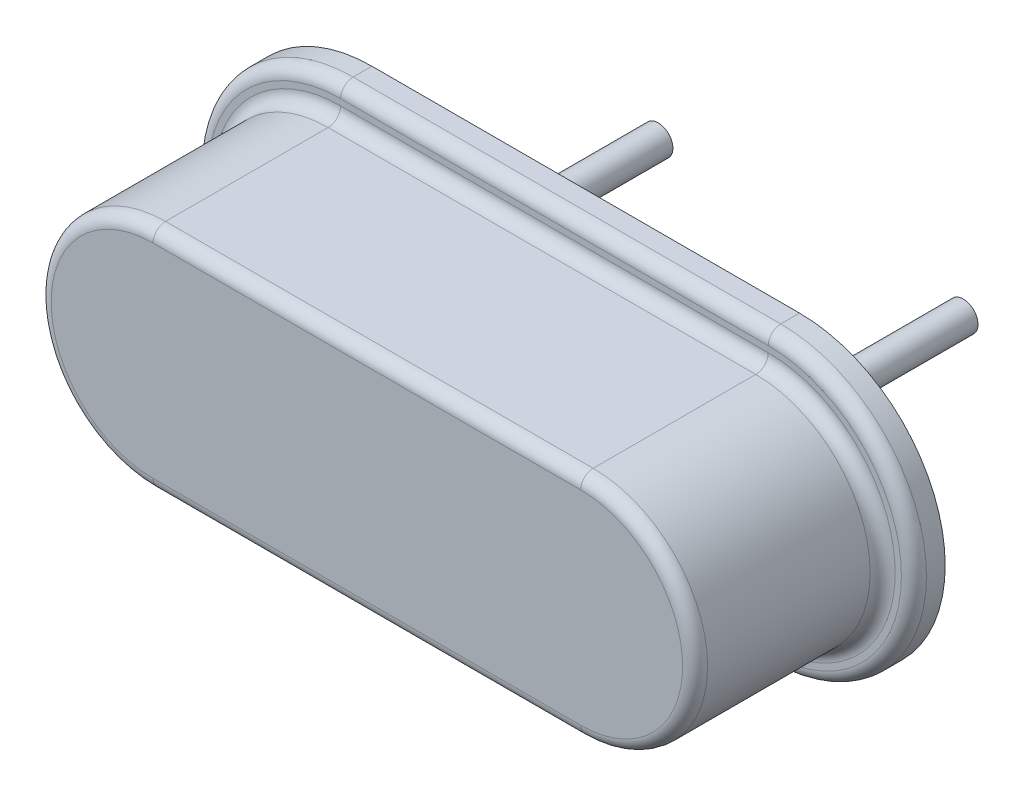
ISO-10303-21;
HEADER;
FILE_DESCRIPTION(('STEP AP214'),'2;1');
FILE_NAME('part.step','',(''),(''),'','','');
FILE_SCHEMA(('AUTOMOTIVE_DESIGN { 1 0 10303 214 1 1 1 1 }'));
ENDSEC;
DATA;
#1=APPLICATION_CONTEXT('core data for automotive mechanical design processes');
#2=APPLICATION_PROTOCOL_DEFINITION('international standard','automotive_design',2000,#1);
#3=PRODUCT_CONTEXT('',#1,'mechanical');
#4=PRODUCT('Part','Part','',(#3));
#5=PRODUCT_RELATED_PRODUCT_CATEGORY('part','',(#4));
#6=PRODUCT_DEFINITION_FORMATION('','',#4);
#7=PRODUCT_DEFINITION_CONTEXT('part definition',#1,'design');
#8=PRODUCT_DEFINITION('design','',#6,#7);
#9=PRODUCT_DEFINITION_SHAPE('','',#8);
#10=(LENGTH_UNIT() NAMED_UNIT(*) SI_UNIT(.MILLI.,.METRE.));
#11=(NAMED_UNIT(*) PLANE_ANGLE_UNIT() SI_UNIT($,.RADIAN.));
#12=(NAMED_UNIT(*) SI_UNIT($,.STERADIAN.) SOLID_ANGLE_UNIT());
#13=UNCERTAINTY_MEASURE_WITH_UNIT(LENGTH_MEASURE(1.E-05),#10,'distance_accuracy_value','');
#14=(GEOMETRIC_REPRESENTATION_CONTEXT(3) GLOBAL_UNCERTAINTY_ASSIGNED_CONTEXT((#13)) GLOBAL_UNIT_ASSIGNED_CONTEXT((#10,
#11,#12)) REPRESENTATION_CONTEXT('',''));
#15=CARTESIAN_POINT('',(0.,0.,0.));
#16=DIRECTION('',(0.,0.,1.));
#17=DIRECTION('',(1.,0.,0.));
#18=AXIS2_PLACEMENT_3D('',#15,#16,#17);
#19=CARTESIAN_POINT('',(-2.44,0.,-3.6));
#20=DIRECTION('',(0.,0.,-1.));
#21=DIRECTION('',(-1.,0.,0.));
#22=AXIS2_PLACEMENT_3D('',#19,#20,#21);
#23=PLANE('',#22);
#24=CARTESIAN_POINT('',(-2.44,0.,-3.6));
#25=DIRECTION('',(0.,0.,-1.));
#26=DIRECTION('',(0.,1.,0.));
#27=AXIS2_PLACEMENT_3D('',#24,#25,#26);
#28=CIRCLE('',#27,0.235);
#29=CARTESIAN_POINT('',(-2.44,0.235,-3.6));
#30=VERTEX_POINT('',#29);
#31=EDGE_CURVE('P0_E17',#30,#30,#28,.F.);
#32=ORIENTED_EDGE('',*,*,#31,.F.);
#33=EDGE_LOOP('',(#32));
#34=FACE_BOUND('',#33,.T.);
#35=ADVANCED_FACE('P0_F14',(#34),#23,.T.);
#36=CARTESIAN_POINT('',(-2.44,0.,0.));
#37=DIRECTION('',(0.,0.,1.));
#38=DIRECTION('',(1.,0.,0.));
#39=AXIS2_PLACEMENT_3D('',#36,#37,#38);
#40=PLANE('',#39);
#41=CARTESIAN_POINT('',(-2.44,0.,0.));
#42=DIRECTION('',(0.,0.,-1.));
#43=DIRECTION('',(0.,1.,0.));
#44=AXIS2_PLACEMENT_3D('',#41,#42,#43);
#45=CIRCLE('',#44,0.235);
#46=CARTESIAN_POINT('',(-2.44,0.235,0.));
#47=VERTEX_POINT('',#46);
#48=EDGE_CURVE('P0_E10',#47,#47,#45,.T.);
#49=ORIENTED_EDGE('',*,*,#48,.F.);
#50=EDGE_LOOP('',(#49));
#51=FACE_BOUND('',#50,.T.);
#52=ADVANCED_FACE('P0_F29',(#51),#40,.T.);
#53=CARTESIAN_POINT('',(-2.44,0.,-1.8));
#54=DIRECTION('',(0.,0.,-1.));
#55=DIRECTION('',(0.,1.,0.));
#56=AXIS2_PLACEMENT_3D('',#53,#54,#55);
#57=CYLINDRICAL_SURFACE('',#56,0.235);
#58=ORIENTED_EDGE('',*,*,#31,.T.);
#59=EDGE_LOOP('',(#58));
#60=FACE_BOUND('',#59,.T.);
#61=ORIENTED_EDGE('',*,*,#48,.T.);
#62=EDGE_LOOP('',(#61));
#63=FACE_BOUND('',#62,.T.);
#64=ADVANCED_FACE('P0_F26',(#60,#63),#57,.T.);
#65=CLOSED_SHELL('',(#35,#52,#64));
#66=MANIFOLD_SOLID_BREP('P0_B1',#65);
#67=CARTESIAN_POINT('',(0.,0.,3.5));
#68=DIRECTION('',(0.,0.,1.));
#69=DIRECTION('',(1.,0.,0.));
#70=AXIS2_PLACEMENT_3D('',#67,#68,#69);
#71=PLANE('',#70);
#72=DIRECTION('',(-1.,0.,0.));
#73=VECTOR('',#72,1.);
#74=CARTESIAN_POINT('',(1.71,-1.63,3.5));
#75=LINE('',#74,#73);
#76=CARTESIAN_POINT('',(3.42,-1.63,3.5));
#77=VERTEX_POINT('',#76);
#78=CARTESIAN_POINT('',(-3.42,-1.63,3.5));
#79=VERTEX_POINT('',#78);
#80=EDGE_CURVE('P1_E112',#77,#79,#75,.T.);
#81=ORIENTED_EDGE('',*,*,#80,.F.);
#82=CARTESIAN_POINT('',(3.42,0.,3.5));
#83=DIRECTION('',(0.,0.,-1.));
#84=DIRECTION('',(0.,1.,0.));
#85=AXIS2_PLACEMENT_3D('',#82,#83,#84);
#86=CIRCLE('',#85,1.63);
#87=CARTESIAN_POINT('',(3.42,1.63,3.5));
#88=VERTEX_POINT('',#87);
#89=EDGE_CURVE('P1_E135',#88,#77,#86,.T.);
#90=ORIENTED_EDGE('',*,*,#89,.F.);
#91=DIRECTION('',(1.,0.,0.));
#92=VECTOR('',#91,1.);
#93=CARTESIAN_POINT('',(-1.71,1.63,3.5));
#94=LINE('',#93,#92);
#95=CARTESIAN_POINT('',(-3.42,1.63,3.5));
#96=VERTEX_POINT('',#95);
#97=EDGE_CURVE('P1_E113',#96,#88,#94,.T.);
#98=ORIENTED_EDGE('',*,*,#97,.F.);
#99=CARTESIAN_POINT('',(-3.42,0.,3.5));
#100=DIRECTION('',(0.,0.,-1.));
#101=DIRECTION('',(0.,-1.,0.));
#102=AXIS2_PLACEMENT_3D('',#99,#100,#101);
#103=CIRCLE('',#102,1.63);
#104=EDGE_CURVE('P1_E108',#79,#96,#103,.T.);
#105=ORIENTED_EDGE('',*,*,#104,.F.);
#106=EDGE_LOOP('',(#81,#90,#98,#105));
#107=FACE_BOUND('',#106,.T.);
#108=ADVANCED_FACE('P1_F16',(#107),#71,.T.);
#109=CARTESIAN_POINT('',(-3.42,0.,3.3));
#110=DIRECTION('',(0.,0.,-1.));
#111=DIRECTION('',(-1.,0.,0.));
#112=AXIS2_PLACEMENT_3D('',#109,#110,#111);
#113=TOROIDAL_SURFACE('',#112,1.63,0.2);
#114=CARTESIAN_POINT('',(-3.42,1.63,3.3));
#115=DIRECTION('',(1.,0.,0.));
#116=DIRECTION('',(0.,0.,-1.));
#117=AXIS2_PLACEMENT_3D('',#114,#115,#116);
#118=CIRCLE('',#117,0.2);
#119=CARTESIAN_POINT('',(-3.42,1.83,3.3));
#120=VERTEX_POINT('',#119);
#121=EDGE_CURVE('P1_E119',#120,#96,#118,.T.);
#122=ORIENTED_EDGE('',*,*,#121,.F.);
#123=CARTESIAN_POINT('',(-3.42,0.,3.3));
#124=DIRECTION('',(0.,0.,1.));
#125=DIRECTION('',(1.,0.,0.));
#126=AXIS2_PLACEMENT_3D('',#123,#124,#125);
#127=CIRCLE('',#126,1.83);
#128=CARTESIAN_POINT('',(-3.42,-1.83,3.3));
#129=VERTEX_POINT('',#128);
#130=EDGE_CURVE('P1_E130',#129,#120,#127,.F.);
#131=ORIENTED_EDGE('',*,*,#130,.F.);
#132=CARTESIAN_POINT('',(-3.42,-1.63,3.3));
#133=DIRECTION('',(-1.,0.,0.));
#134=DIRECTION('',(0.,0.,1.));
#135=AXIS2_PLACEMENT_3D('',#132,#133,#134);
#136=CIRCLE('',#135,0.2);
#137=EDGE_CURVE('P1_E126',#79,#129,#136,.F.);
#138=ORIENTED_EDGE('',*,*,#137,.F.);
#139=ORIENTED_EDGE('',*,*,#104,.T.);
#140=EDGE_LOOP('',(#122,#131,#138,#139));
#141=FACE_BOUND('',#140,.T.);
#142=ADVANCED_FACE('P1_F133',(#141),#113,.T.);
#143=CARTESIAN_POINT('',(-1.71,1.63,3.3));
#144=DIRECTION('',(1.,0.,0.));
#145=DIRECTION('',(0.,0.,-1.));
#146=AXIS2_PLACEMENT_3D('',#143,#144,#145);
#147=CYLINDRICAL_SURFACE('',#146,0.2);
#148=CARTESIAN_POINT('',(3.42,1.63,3.3));
#149=DIRECTION('',(1.,0.,0.));
#150=DIRECTION('',(0.,1.,0.));
#151=AXIS2_PLACEMENT_3D('',#148,#149,#150);
#152=CIRCLE('',#151,0.2);
#153=CARTESIAN_POINT('',(3.42,1.83,3.3));
#154=VERTEX_POINT('',#153);
#155=EDGE_CURVE('P1_E138',#154,#88,#152,.T.);
#156=ORIENTED_EDGE('',*,*,#155,.F.);
#157=DIRECTION('',(1.,0.,0.));
#158=VECTOR('',#157,1.);
#159=CARTESIAN_POINT('',(-3.42,1.83,3.3));
#160=LINE('',#159,#158);
#161=EDGE_CURVE('P1_E144',#120,#154,#160,.T.);
#162=ORIENTED_EDGE('',*,*,#161,.F.);
#163=ORIENTED_EDGE('',*,*,#121,.T.);
#164=ORIENTED_EDGE('',*,*,#97,.T.);
#165=EDGE_LOOP('',(#156,#162,#163,#164));
#166=FACE_BOUND('',#165,.T.);
#167=ADVANCED_FACE('P1_F158',(#166),#147,.T.);
#168=CARTESIAN_POINT('',(3.42,0.,3.3));
#169=DIRECTION('',(0.,0.,-1.));
#170=DIRECTION('',(-1.,0.,0.));
#171=AXIS2_PLACEMENT_3D('',#168,#169,#170);
#172=TOROIDAL_SURFACE('',#171,1.63,0.2);
#173=ORIENTED_EDGE('',*,*,#155,.T.);
#174=ORIENTED_EDGE('',*,*,#89,.T.);
#175=CARTESIAN_POINT('',(3.42,-1.63,3.3));
#176=DIRECTION('',(-1.,0.,0.));
#177=DIRECTION('',(0.,0.,1.));
#178=AXIS2_PLACEMENT_3D('',#175,#176,#177);
#179=CIRCLE('',#178,0.2);
#180=CARTESIAN_POINT('',(3.42,-1.83,3.3));
#181=VERTEX_POINT('',#180);
#182=EDGE_CURVE('P1_E129',#181,#77,#179,.T.);
#183=ORIENTED_EDGE('',*,*,#182,.F.);
#184=CARTESIAN_POINT('',(3.42,0.,3.3));
#185=DIRECTION('',(0.,0.,1.));
#186=DIRECTION('',(1.,0.,0.));
#187=AXIS2_PLACEMENT_3D('',#184,#185,#186);
#188=CIRCLE('',#187,1.83);
#189=EDGE_CURVE('P1_E206',#154,#181,#188,.F.);
#190=ORIENTED_EDGE('',*,*,#189,.F.);
#191=EDGE_LOOP('',(#173,#174,#183,#190));
#192=FACE_BOUND('',#191,.T.);
#193=ADVANCED_FACE('P1_F153',(#192),#172,.T.);
#194=CARTESIAN_POINT('',(1.71,-1.63,3.3));
#195=DIRECTION('',(-1.,0.,0.));
#196=DIRECTION('',(0.,0.,1.));
#197=AXIS2_PLACEMENT_3D('',#194,#195,#196);
#198=CYLINDRICAL_SURFACE('',#197,0.2);
#199=ORIENTED_EDGE('',*,*,#182,.T.);
#200=ORIENTED_EDGE('',*,*,#80,.T.);
#201=ORIENTED_EDGE('',*,*,#137,.T.);
#202=DIRECTION('',(1.,0.,0.));
#203=VECTOR('',#202,1.);
#204=CARTESIAN_POINT('',(3.42,-1.83,3.3));
#205=LINE('',#204,#203);
#206=EDGE_CURVE('P1_E218',#181,#129,#205,.F.);
#207=ORIENTED_EDGE('',*,*,#206,.F.);
#208=EDGE_LOOP('',(#199,#200,#201,#207));
#209=FACE_BOUND('',#208,.T.);
#210=ADVANCED_FACE('P1_F124',(#209),#198,.T.);
#211=CARTESIAN_POINT('',(-3.42,0.,0.5));
#212=DIRECTION('',(0.,0.,1.));
#213=DIRECTION('',(1.,0.,0.));
#214=AXIS2_PLACEMENT_3D('',#211,#212,#213);
#215=CYLINDRICAL_SURFACE('',#214,1.83);
#216=CARTESIAN_POINT('',(-3.42,0.,0.7));
#217=DIRECTION('',(0.,0.,-1.));
#218=DIRECTION('',(-1.,0.,0.));
#219=AXIS2_PLACEMENT_3D('',#216,#217,#218);
#220=CIRCLE('',#219,1.83000000000007);
#221=CARTESIAN_POINT('',(-3.42,-1.83000000000002,0.7));
#222=VERTEX_POINT('',#221);
#223=CARTESIAN_POINT('',(-3.42,1.83000000000002,0.7));
#224=VERTEX_POINT('',#223);
#225=EDGE_CURVE('P1_E226',#222,#224,#220,.T.);
#226=ORIENTED_EDGE('',*,*,#225,.F.);
#227=DIRECTION('',(0.,0.,-1.));
#228=VECTOR('',#227,1.);
#229=CARTESIAN_POINT('',(-3.42,-1.83,0.5));
#230=LINE('',#229,#228);
#231=EDGE_CURVE('P1_E220',#129,#222,#230,.T.);
#232=ORIENTED_EDGE('',*,*,#231,.F.);
#233=ORIENTED_EDGE('',*,*,#130,.T.);
#234=DIRECTION('',(0.,0.,1.));
#235=VECTOR('',#234,1.);
#236=CARTESIAN_POINT('',(-3.42,1.83,0.5));
#237=LINE('',#236,#235);
#238=EDGE_CURVE('P1_E146',#224,#120,#237,.T.);
#239=ORIENTED_EDGE('',*,*,#238,.F.);
#240=EDGE_LOOP('',(#226,#232,#233,#239));
#241=FACE_BOUND('',#240,.T.);
#242=ADVANCED_FACE('P1_F225',(#241),#215,.T.);
#243=CARTESIAN_POINT('',(-3.42,1.83,0.5));
#244=DIRECTION('',(0.,1.,0.));
#245=DIRECTION('',(0.,0.,1.));
#246=AXIS2_PLACEMENT_3D('',#243,#244,#245);
#247=PLANE('',#246);
#248=DIRECTION('',(1.,0.,0.));
#249=VECTOR('',#248,1.);
#250=CARTESIAN_POINT('',(-1.71,1.83,0.7));
#251=LINE('',#250,#249);
#252=CARTESIAN_POINT('',(3.42,1.83000000000001,0.7));
#253=VERTEX_POINT('',#252);
#254=EDGE_CURVE('P1_E202',#253,#224,#251,.F.);
#255=ORIENTED_EDGE('',*,*,#254,.T.);
#256=ORIENTED_EDGE('',*,*,#238,.T.);
#257=ORIENTED_EDGE('',*,*,#161,.T.);
#258=DIRECTION('',(0.,0.,1.));
#259=VECTOR('',#258,1.);
#260=CARTESIAN_POINT('',(3.42,1.83,0.5));
#261=LINE('',#260,#259);
#262=EDGE_CURVE('P1_E208',#253,#154,#261,.T.);
#263=ORIENTED_EDGE('',*,*,#262,.F.);
#264=EDGE_LOOP('',(#255,#256,#257,#263));
#265=FACE_BOUND('',#264,.T.);
#266=ADVANCED_FACE('P1_F200',(#265),#247,.T.);
#267=CARTESIAN_POINT('',(3.42,0.,0.5));
#268=DIRECTION('',(0.,0.,1.));
#269=DIRECTION('',(1.,0.,0.));
#270=AXIS2_PLACEMENT_3D('',#267,#268,#269);
#271=CYLINDRICAL_SURFACE('',#270,1.83);
#272=CARTESIAN_POINT('',(3.42,0.,0.7));
#273=DIRECTION('',(0.,0.,-1.));
#274=DIRECTION('',(-1.,0.,0.));
#275=AXIS2_PLACEMENT_3D('',#272,#273,#274);
#276=CIRCLE('',#275,1.83000000000007);
#277=CARTESIAN_POINT('',(3.42,-1.83000000000002,0.7));
#278=VERTEX_POINT('',#277);
#279=EDGE_CURVE('P1_E70',#253,#278,#276,.T.);
#280=ORIENTED_EDGE('',*,*,#279,.F.);
#281=ORIENTED_EDGE('',*,*,#262,.T.);
#282=ORIENTED_EDGE('',*,*,#189,.T.);
#283=DIRECTION('',(0.,0.,-1.));
#284=VECTOR('',#283,1.);
#285=CARTESIAN_POINT('',(3.42,-1.83,0.5));
#286=LINE('',#285,#284);
#287=EDGE_CURVE('P1_E229',#278,#181,#286,.F.);
#288=ORIENTED_EDGE('',*,*,#287,.F.);
#289=EDGE_LOOP('',(#280,#281,#282,#288));
#290=FACE_BOUND('',#289,.T.);
#291=ADVANCED_FACE('P1_F580',(#290),#271,.T.);
#292=CARTESIAN_POINT('',(3.42,-1.83,0.5));
#293=DIRECTION('',(0.,-1.,0.));
#294=DIRECTION('',(0.,0.,-1.));
#295=AXIS2_PLACEMENT_3D('',#292,#293,#294);
#296=PLANE('',#295);
#297=DIRECTION('',(-1.,0.,0.));
#298=VECTOR('',#297,1.);
#299=CARTESIAN_POINT('',(1.71,-1.83,0.7));
#300=LINE('',#299,#298);
#301=EDGE_CURVE('P1_E260',#222,#278,#300,.F.);
#302=ORIENTED_EDGE('',*,*,#301,.T.);
#303=ORIENTED_EDGE('',*,*,#287,.T.);
#304=ORIENTED_EDGE('',*,*,#206,.T.);
#305=ORIENTED_EDGE('',*,*,#231,.T.);
#306=EDGE_LOOP('',(#302,#303,#304,#305));
#307=FACE_BOUND('',#306,.T.);
#308=ADVANCED_FACE('P1_F573',(#307),#296,.T.);
#309=CARTESIAN_POINT('',(-3.42,0.,0.7));
#310=DIRECTION('',(0.,0.,-1.));
#311=DIRECTION('',(-1.,0.,0.));
#312=AXIS2_PLACEMENT_3D('',#309,#310,#311);
#313=TOROIDAL_SURFACE('',#312,2.03,0.200000000000007);
#314=CARTESIAN_POINT('',(-3.42,2.03,0.7));
#315=DIRECTION('',(1.,0.,0.));
#316=DIRECTION('',(0.,0.,-1.));
#317=AXIS2_PLACEMENT_3D('',#314,#315,#316);
#318=CIRCLE('',#317,0.2);
#319=CARTESIAN_POINT('',(-3.42,2.03,0.5));
#320=VERTEX_POINT('',#319);
#321=EDGE_CURVE('P1_E244',#224,#320,#318,.T.);
#322=ORIENTED_EDGE('',*,*,#321,.T.);
#323=CARTESIAN_POINT('',(-3.42,-2.03,0.5));
#324=CARTESIAN_POINT('',(-3.80694173072653,-2.03,0.5));
#325=CARTESIAN_POINT('',(-4.1672322604106,-1.88747025115673,0.5));
#326=CARTESIAN_POINT('',(-4.55768861721886,-1.73300700029378,0.5));
#327=CARTESIAN_POINT('',(-4.85542676580869,-1.43542676580869,0.5));
#328=CARTESIAN_POINT('',(-5.15241952645898,-1.13859152392493,0.5));
#329=CARTESIAN_POINT('',(-5.30747025115673,-0.747232260410602,0.5));
#330=CARTESIAN_POINT('',(-5.44989869532549,-0.387732547513189,0.5));
#331=CARTESIAN_POINT('',(-5.45,0.,0.5));
#332=CARTESIAN_POINT('',(-5.4501010313273,0.386686341021617,0.5));
#333=CARTESIAN_POINT('',(-5.30747025115673,0.747232260410602,0.5));
#334=CARTESIAN_POINT('',(-5.15300700029418,1.13768861721837,0.5));
#335=CARTESIAN_POINT('',(-4.85542676580869,1.43542676580869,0.5));
#336=CARTESIAN_POINT('',(-4.5585915239251,1.7324195264589,0.5));
#337=CARTESIAN_POINT('',(-4.1672322604106,1.88747025115673,0.5));
#338=CARTESIAN_POINT('',(-3.80747684717463,2.03,0.5));
#339=CARTESIAN_POINT('',(-3.42,2.03,0.5));
#340=B_SPLINE_CURVE_WITH_KNOTS('',2,(#323,#324,#325,#326,#327,#328,#329,#330,#331,#332,#333,
#334,#335,#336,#337,#338,#339),.UNSPECIFIED.,.F.,.F.,(3,2,2,2,2,2,2,2,3),(0.,0.125,0.25,0.375,
0.5,0.625,0.75,0.875,1.),.UNSPECIFIED.);
#341=CARTESIAN_POINT('',(-3.42,-2.03,0.5));
#342=VERTEX_POINT('',#341);
#343=EDGE_CURVE('P1_E264',#342,#320,#340,.T.);
#344=ORIENTED_EDGE('',*,*,#343,.F.);
#345=CARTESIAN_POINT('',(-3.42,-2.03,0.7));
#346=DIRECTION('',(-1.,0.,0.));
#347=DIRECTION('',(0.,0.,1.));
#348=AXIS2_PLACEMENT_3D('',#345,#346,#347);
#349=CIRCLE('',#348,0.2);
#350=EDGE_CURVE('P1_E60',#342,#222,#349,.F.);
#351=ORIENTED_EDGE('',*,*,#350,.T.);
#352=ORIENTED_EDGE('',*,*,#225,.T.);
#353=EDGE_LOOP('',(#322,#344,#351,#352));
#354=FACE_BOUND('',#353,.T.);
#355=ADVANCED_FACE('P1_F564',(#354),#313,.F.);
#356=CARTESIAN_POINT('',(-1.71,2.03,0.7));
#357=DIRECTION('',(1.,0.,0.));
#358=DIRECTION('',(0.,0.,-1.));
#359=AXIS2_PLACEMENT_3D('',#356,#357,#358);
#360=CYLINDRICAL_SURFACE('',#359,0.2);
#361=DIRECTION('',(1.,0.,0.));
#362=VECTOR('',#361,1.);
#363=CARTESIAN_POINT('',(0.,2.03,0.5));
#364=LINE('',#363,#362);
#365=CARTESIAN_POINT('',(3.42,2.03,0.5));
#366=VERTEX_POINT('',#365);
#367=EDGE_CURVE('P1_E331',#320,#366,#364,.T.);
#368=ORIENTED_EDGE('',*,*,#367,.F.);
#369=ORIENTED_EDGE('',*,*,#321,.F.);
#370=ORIENTED_EDGE('',*,*,#254,.F.);
#371=CARTESIAN_POINT('',(3.42,2.03,0.7));
#372=DIRECTION('',(-1.,0.,0.));
#373=DIRECTION('',(0.,0.,1.));
#374=AXIS2_PLACEMENT_3D('',#371,#372,#373);
#375=CIRCLE('',#374,0.200000000000008);
#376=EDGE_CURVE('P1_E246',#366,#253,#375,.T.);
#377=ORIENTED_EDGE('',*,*,#376,.F.);
#378=EDGE_LOOP('',(#368,#369,#370,#377));
#379=FACE_BOUND('',#378,.T.);
#380=ADVANCED_FACE('P1_F557',(#379),#360,.F.);
#381=CARTESIAN_POINT('',(3.42,0.,0.699999999999999));
#382=DIRECTION('',(0.,0.,-1.));
#383=DIRECTION('',(-1.,0.,0.));
#384=AXIS2_PLACEMENT_3D('',#381,#382,#383);
#385=TOROIDAL_SURFACE('',#384,2.03,0.200000000000007);
#386=ORIENTED_EDGE('',*,*,#376,.T.);
#387=ORIENTED_EDGE('',*,*,#279,.T.);
#388=CARTESIAN_POINT('',(3.42,-2.03,0.7));
#389=DIRECTION('',(-1.,0.,0.));
#390=DIRECTION('',(0.,0.,1.));
#391=AXIS2_PLACEMENT_3D('',#388,#389,#390);
#392=CIRCLE('',#391,0.2);
#393=CARTESIAN_POINT('',(3.42,-2.03,0.5));
#394=VERTEX_POINT('',#393);
#395=EDGE_CURVE('P1_E262',#278,#394,#392,.T.);
#396=ORIENTED_EDGE('',*,*,#395,.T.);
#397=CARTESIAN_POINT('',(3.42,2.03,0.5));
#398=CARTESIAN_POINT('',(3.80694173072653,2.03,0.5));
#399=CARTESIAN_POINT('',(4.1672322604106,1.88747025115673,0.5));
#400=CARTESIAN_POINT('',(4.55768861721858,1.73300700029389,0.5));
#401=CARTESIAN_POINT('',(4.85542676580869,1.43542676580869,0.5));
#402=CARTESIAN_POINT('',(5.15241952645887,1.13859152392521,0.5));
#403=CARTESIAN_POINT('',(5.30747025115673,0.747232260410602,0.5));
#404=CARTESIAN_POINT('',(5.44989869532549,0.387732547513188,0.5));
#405=CARTESIAN_POINT('',(5.45,0.,0.5));
#406=CARTESIAN_POINT('',(5.4501010313273,-0.386686341021618,0.5));
#407=CARTESIAN_POINT('',(5.30747025115673,-0.747232260410603,0.5));
#408=CARTESIAN_POINT('',(5.15300700029429,-1.13768861721809,0.5));
#409=CARTESIAN_POINT('',(4.85542676580869,-1.43542676580869,0.5));
#410=CARTESIAN_POINT('',(4.55859152392568,-1.73241952645849,0.5));
#411=CARTESIAN_POINT('',(4.1672322604106,-1.88747025115673,0.5));
#412=CARTESIAN_POINT('',(3.80747684717504,-2.03,0.5));
#413=CARTESIAN_POINT('',(3.42,-2.03,0.5));
#414=B_SPLINE_CURVE_WITH_KNOTS('',2,(#397,#398,#399,#400,#401,#402,#403,#404,#405,#406,#407,
#408,#409,#410,#411,#412,#413),.UNSPECIFIED.,.F.,.F.,(3,2,2,2,2,2,2,2,3),(0.,0.125,0.25,0.375,
0.5,0.625,0.75,0.875,1.),.UNSPECIFIED.);
#415=EDGE_CURVE('P1_E332',#366,#394,#414,.T.);
#416=ORIENTED_EDGE('',*,*,#415,.F.);
#417=EDGE_LOOP('',(#386,#387,#396,#416));
#418=FACE_BOUND('',#417,.T.);
#419=ADVANCED_FACE('P1_F18',(#418),#385,.F.);
#420=CARTESIAN_POINT('',(1.71,-2.03,0.7));
#421=DIRECTION('',(-1.,0.,0.));
#422=DIRECTION('',(0.,0.,1.));
#423=AXIS2_PLACEMENT_3D('',#420,#421,#422);
#424=CYLINDRICAL_SURFACE('',#423,0.2);
#425=ORIENTED_EDGE('',*,*,#301,.F.);
#426=ORIENTED_EDGE('',*,*,#350,.F.);
#427=DIRECTION('',(1.,0.,0.));
#428=VECTOR('',#427,1.);
#429=CARTESIAN_POINT('',(0.,-2.03,0.5));
#430=LINE('',#429,#428);
#431=EDGE_CURVE('P1_E340',#394,#342,#430,.F.);
#432=ORIENTED_EDGE('',*,*,#431,.F.);
#433=ORIENTED_EDGE('',*,*,#395,.F.);
#434=EDGE_LOOP('',(#425,#426,#432,#433));
#435=FACE_BOUND('',#434,.T.);
#436=ADVANCED_FACE('P1_F404',(#435),#424,.F.);
#437=CARTESIAN_POINT('',(0.,0.,0.5));
#438=DIRECTION('',(0.,0.,1.));
#439=DIRECTION('',(1.,0.,0.));
#440=AXIS2_PLACEMENT_3D('',#437,#438,#439);
#441=PLANE('',#440);
#442=ORIENTED_EDGE('',*,*,#415,.T.);
#443=ORIENTED_EDGE('',*,*,#431,.T.);
#444=ORIENTED_EDGE('',*,*,#343,.T.);
#445=ORIENTED_EDGE('',*,*,#367,.T.);
#446=EDGE_LOOP('',(#442,#443,#444,#445));
#447=FACE_BOUND('',#446,.T.);
#448=CARTESIAN_POINT('',(3.42,0.,0.5));
#449=DIRECTION('',(0.,0.,-1.));
#450=DIRECTION('',(0.,1.,0.));
#451=AXIS2_PLACEMENT_3D('',#448,#449,#450);
#452=CIRCLE('',#451,2.13);
#453=CARTESIAN_POINT('',(3.42,2.13,0.5));
#454=VERTEX_POINT('',#453);
#455=CARTESIAN_POINT('',(3.42,-2.13,0.5));
#456=VERTEX_POINT('',#455);
#457=EDGE_CURVE('P1_E319',#454,#456,#452,.T.);
#458=ORIENTED_EDGE('',*,*,#457,.F.);
#459=DIRECTION('',(1.,0.,0.));
#460=VECTOR('',#459,1.);
#461=CARTESIAN_POINT('',(-1.71,2.13,0.5));
#462=LINE('',#461,#460);
#463=CARTESIAN_POINT('',(-3.42,2.13,0.5));
#464=VERTEX_POINT('',#463);
#465=EDGE_CURVE('P1_E348',#464,#454,#462,.T.);
#466=ORIENTED_EDGE('',*,*,#465,.F.);
#467=CARTESIAN_POINT('',(-3.42,0.,0.5));
#468=DIRECTION('',(0.,0.,-1.));
#469=DIRECTION('',(0.,-1.,0.));
#470=AXIS2_PLACEMENT_3D('',#467,#468,#469);
#471=CIRCLE('',#470,2.13);
#472=CARTESIAN_POINT('',(-3.42,-2.13,0.5));
#473=VERTEX_POINT('',#472);
#474=EDGE_CURVE('P1_E305',#473,#464,#471,.T.);
#475=ORIENTED_EDGE('',*,*,#474,.F.);
#476=DIRECTION('',(-1.,0.,0.));
#477=VECTOR('',#476,1.);
#478=CARTESIAN_POINT('',(1.71,-2.13,0.5));
#479=LINE('',#478,#477);
#480=EDGE_CURVE('P1_E363',#456,#473,#479,.T.);
#481=ORIENTED_EDGE('',*,*,#480,.F.);
#482=EDGE_LOOP('',(#458,#466,#475,#481));
#483=FACE_BOUND('',#482,.T.);
#484=ADVANCED_FACE('P1_F290',(#447,#483),#441,.T.);
#485=CARTESIAN_POINT('',(-3.42,0.,0.3));
#486=DIRECTION('',(0.,0.,-1.));
#487=DIRECTION('',(-1.,0.,0.));
#488=AXIS2_PLACEMENT_3D('',#485,#486,#487);
#489=TOROIDAL_SURFACE('',#488,2.13,0.2);
#490=CARTESIAN_POINT('',(-3.42,2.13,0.3));
#491=DIRECTION('',(1.,0.,0.));
#492=DIRECTION('',(0.,0.,-1.));
#493=AXIS2_PLACEMENT_3D('',#490,#491,#492);
#494=CIRCLE('',#493,0.2);
#495=CARTESIAN_POINT('',(-3.42,2.33,0.3));
#496=VERTEX_POINT('',#495);
#497=EDGE_CURVE('P1_E351',#496,#464,#494,.T.);
#498=ORIENTED_EDGE('',*,*,#497,.F.);
#499=CARTESIAN_POINT('',(-3.42,0.,0.3));
#500=DIRECTION('',(0.,0.,1.));
#501=DIRECTION('',(1.,0.,0.));
#502=AXIS2_PLACEMENT_3D('',#499,#500,#501);
#503=CIRCLE('',#502,2.33);
#504=CARTESIAN_POINT('',(-3.42,-2.33,0.3));
#505=VERTEX_POINT('',#504);
#506=EDGE_CURVE('P1_E350',#505,#496,#503,.F.);
#507=ORIENTED_EDGE('',*,*,#506,.F.);
#508=CARTESIAN_POINT('',(-3.42,-2.13,0.3));
#509=DIRECTION('',(-1.,0.,0.));
#510=DIRECTION('',(0.,0.,1.));
#511=AXIS2_PLACEMENT_3D('',#508,#509,#510);
#512=CIRCLE('',#511,0.2);
#513=EDGE_CURVE('P1_E383',#473,#505,#512,.F.);
#514=ORIENTED_EDGE('',*,*,#513,.F.);
#515=ORIENTED_EDGE('',*,*,#474,.T.);
#516=EDGE_LOOP('',(#498,#507,#514,#515));
#517=FACE_BOUND('',#516,.T.);
#518=ADVANCED_FACE('P1_F278',(#517),#489,.T.);
#519=CARTESIAN_POINT('',(1.71,-2.13,0.3));
#520=DIRECTION('',(-1.,0.,0.));
#521=DIRECTION('',(0.,0.,1.));
#522=AXIS2_PLACEMENT_3D('',#519,#520,#521);
#523=CYLINDRICAL_SURFACE('',#522,0.2);
#524=ORIENTED_EDGE('',*,*,#513,.T.);
#525=DIRECTION('',(1.,0.,0.));
#526=VECTOR('',#525,1.);
#527=CARTESIAN_POINT('',(3.42,-2.33,0.3));
#528=LINE('',#527,#526);
#529=CARTESIAN_POINT('',(3.42,-2.33,0.3));
#530=VERTEX_POINT('',#529);
#531=EDGE_CURVE('P1_E457',#530,#505,#528,.F.);
#532=ORIENTED_EDGE('',*,*,#531,.F.);
#533=CARTESIAN_POINT('',(3.42,-2.13,0.3));
#534=DIRECTION('',(-1.,0.,0.));
#535=DIRECTION('',(0.,-1.,0.));
#536=AXIS2_PLACEMENT_3D('',#533,#534,#535);
#537=CIRCLE('',#536,0.2);
#538=EDGE_CURVE('P1_E381',#456,#530,#537,.F.);
#539=ORIENTED_EDGE('',*,*,#538,.F.);
#540=ORIENTED_EDGE('',*,*,#480,.T.);
#541=EDGE_LOOP('',(#524,#532,#539,#540));
#542=FACE_BOUND('',#541,.T.);
#543=ADVANCED_FACE('P1_F289',(#542),#523,.T.);
#544=CARTESIAN_POINT('',(3.42,0.,0.3));
#545=DIRECTION('',(0.,0.,-1.));
#546=DIRECTION('',(-1.,0.,0.));
#547=AXIS2_PLACEMENT_3D('',#544,#545,#546);
#548=TOROIDAL_SURFACE('',#547,2.13,0.2);
#549=CARTESIAN_POINT('',(3.42,2.13,0.3));
#550=DIRECTION('',(1.,0.,0.));
#551=DIRECTION('',(0.,0.,-1.));
#552=AXIS2_PLACEMENT_3D('',#549,#550,#551);
#553=CIRCLE('',#552,0.2);
#554=CARTESIAN_POINT('',(3.42,2.33,0.3));
#555=VERTEX_POINT('',#554);
#556=EDGE_CURVE('P1_E401',#454,#555,#553,.F.);
#557=ORIENTED_EDGE('',*,*,#556,.F.);
#558=ORIENTED_EDGE('',*,*,#457,.T.);
#559=ORIENTED_EDGE('',*,*,#538,.T.);
#560=CARTESIAN_POINT('',(3.42,0.,0.3));
#561=DIRECTION('',(0.,0.,1.));
#562=DIRECTION('',(1.,0.,0.));
#563=AXIS2_PLACEMENT_3D('',#560,#561,#562);
#564=CIRCLE('',#563,2.33);
#565=EDGE_CURVE('P1_E453',#555,#530,#564,.F.);
#566=ORIENTED_EDGE('',*,*,#565,.F.);
#567=EDGE_LOOP('',(#557,#558,#559,#566));
#568=FACE_BOUND('',#567,.T.);
#569=ADVANCED_FACE('P1_F364',(#568),#548,.T.);
#570=CARTESIAN_POINT('',(-1.71,2.13,0.3));
#571=DIRECTION('',(1.,0.,0.));
#572=DIRECTION('',(0.,0.,-1.));
#573=AXIS2_PLACEMENT_3D('',#570,#571,#572);
#574=CYLINDRICAL_SURFACE('',#573,0.2);
#575=ORIENTED_EDGE('',*,*,#497,.T.);
#576=ORIENTED_EDGE('',*,*,#465,.T.);
#577=ORIENTED_EDGE('',*,*,#556,.T.);
#578=DIRECTION('',(1.,0.,0.));
#579=VECTOR('',#578,1.);
#580=CARTESIAN_POINT('',(-3.42,2.33,0.3));
#581=LINE('',#580,#579);
#582=EDGE_CURVE('P1_E400',#496,#555,#581,.T.);
#583=ORIENTED_EDGE('',*,*,#582,.F.);
#584=EDGE_LOOP('',(#575,#576,#577,#583));
#585=FACE_BOUND('',#584,.T.);
#586=ADVANCED_FACE('P1_F374',(#585),#574,.T.);
#587=CARTESIAN_POINT('',(-3.42,0.,0.));
#588=DIRECTION('',(0.,0.,1.));
#589=DIRECTION('',(1.,0.,0.));
#590=AXIS2_PLACEMENT_3D('',#587,#588,#589);
#591=CYLINDRICAL_SURFACE('',#590,2.33);
#592=CARTESIAN_POINT('',(-3.42,0.,0.));
#593=DIRECTION('',(0.,0.,1.));
#594=DIRECTION('',(1.,0.,0.));
#595=AXIS2_PLACEMENT_3D('',#592,#593,#594);
#596=CIRCLE('',#595,2.33);
#597=CARTESIAN_POINT('',(-3.42,2.33,0.));
#598=VERTEX_POINT('',#597);
#599=CARTESIAN_POINT('',(-3.42,-2.33,0.));
#600=VERTEX_POINT('',#599);
#601=EDGE_CURVE('P1_E20',#598,#600,#596,.T.);
#602=ORIENTED_EDGE('',*,*,#601,.T.);
#603=DIRECTION('',(0.,0.,-1.));
#604=VECTOR('',#603,1.);
#605=CARTESIAN_POINT('',(-3.42,-2.33,0.));
#606=LINE('',#605,#604);
#607=EDGE_CURVE('P1_E438',#505,#600,#606,.T.);
#608=ORIENTED_EDGE('',*,*,#607,.F.);
#609=ORIENTED_EDGE('',*,*,#506,.T.);
#610=DIRECTION('',(0.,0.,1.));
#611=VECTOR('',#610,1.);
#612=CARTESIAN_POINT('',(-3.42,2.33,0.));
#613=LINE('',#612,#611);
#614=EDGE_CURVE('P1_E439',#598,#496,#613,.T.);
#615=ORIENTED_EDGE('',*,*,#614,.F.);
#616=EDGE_LOOP('',(#602,#608,#609,#615));
#617=FACE_BOUND('',#616,.T.);
#618=ADVANCED_FACE('P1_F427',(#617),#591,.T.);
#619=CARTESIAN_POINT('',(3.42,-2.33,0.));
#620=DIRECTION('',(0.,-1.,0.));
#621=DIRECTION('',(0.,0.,-1.));
#622=AXIS2_PLACEMENT_3D('',#619,#620,#621);
#623=PLANE('',#622);
#624=DIRECTION('',(1.,0.,0.));
#625=VECTOR('',#624,1.);
#626=CARTESIAN_POINT('',(0.,-2.33,0.));
#627=LINE('',#626,#625);
#628=CARTESIAN_POINT('',(3.42,-2.33,0.));
#629=VERTEX_POINT('',#628);
#630=EDGE_CURVE('P1_E441',#600,#629,#627,.T.);
#631=ORIENTED_EDGE('',*,*,#630,.T.);
#632=DIRECTION('',(0.,0.,1.));
#633=VECTOR('',#632,1.);
#634=CARTESIAN_POINT('',(3.42,-2.33,0.));
#635=LINE('',#634,#633);
#636=EDGE_CURVE('P1_E451',#530,#629,#635,.F.);
#637=ORIENTED_EDGE('',*,*,#636,.F.);
#638=ORIENTED_EDGE('',*,*,#531,.T.);
#639=ORIENTED_EDGE('',*,*,#607,.T.);
#640=EDGE_LOOP('',(#631,#637,#638,#639));
#641=FACE_BOUND('',#640,.T.);
#642=ADVANCED_FACE('P1_F424',(#641),#623,.T.);
#643=CARTESIAN_POINT('',(3.42,0.,0.));
#644=DIRECTION('',(0.,0.,1.));
#645=DIRECTION('',(1.,0.,0.));
#646=AXIS2_PLACEMENT_3D('',#643,#644,#645);
#647=CYLINDRICAL_SURFACE('',#646,2.33);
#648=CARTESIAN_POINT('',(3.42,0.,0.));
#649=DIRECTION('',(0.,0.,1.));
#650=DIRECTION('',(1.,0.,0.));
#651=AXIS2_PLACEMENT_3D('',#648,#649,#650);
#652=CIRCLE('',#651,2.33);
#653=CARTESIAN_POINT('',(3.42,2.33,0.));
#654=VERTEX_POINT('',#653);
#655=EDGE_CURVE('P1_E26',#629,#654,#652,.T.);
#656=ORIENTED_EDGE('',*,*,#655,.T.);
#657=DIRECTION('',(0.,0.,1.));
#658=VECTOR('',#657,1.);
#659=CARTESIAN_POINT('',(3.42,2.33,0.));
#660=LINE('',#659,#658);
#661=EDGE_CURVE('P1_E34',#555,#654,#660,.F.);
#662=ORIENTED_EDGE('',*,*,#661,.F.);
#663=ORIENTED_EDGE('',*,*,#565,.T.);
#664=ORIENTED_EDGE('',*,*,#636,.T.);
#665=EDGE_LOOP('',(#656,#662,#663,#664));
#666=FACE_BOUND('',#665,.T.);
#667=ADVANCED_FACE('P1_F418',(#666),#647,.T.);
#668=CARTESIAN_POINT('',(-3.42,2.33,0.));
#669=DIRECTION('',(0.,1.,0.));
#670=DIRECTION('',(0.,0.,1.));
#671=AXIS2_PLACEMENT_3D('',#668,#669,#670);
#672=PLANE('',#671);
#673=DIRECTION('',(1.,0.,0.));
#674=VECTOR('',#673,1.);
#675=CARTESIAN_POINT('',(0.,2.33,0.));
#676=LINE('',#675,#674);
#677=EDGE_CURVE('P1_E11',#654,#598,#676,.F.);
#678=ORIENTED_EDGE('',*,*,#677,.T.);
#679=ORIENTED_EDGE('',*,*,#614,.T.);
#680=ORIENTED_EDGE('',*,*,#582,.T.);
#681=ORIENTED_EDGE('',*,*,#661,.T.);
#682=EDGE_LOOP('',(#678,#679,#680,#681));
#683=FACE_BOUND('',#682,.T.);
#684=ADVANCED_FACE('P1_F412',(#683),#672,.T.);
#685=CARTESIAN_POINT('',(0.,0.,0.));
#686=DIRECTION('',(0.,0.,1.));
#687=DIRECTION('',(1.,0.,0.));
#688=AXIS2_PLACEMENT_3D('',#685,#686,#687);
#689=PLANE('',#688);
#690=ORIENTED_EDGE('',*,*,#655,.F.);
#691=ORIENTED_EDGE('',*,*,#630,.F.);
#692=ORIENTED_EDGE('',*,*,#601,.F.);
#693=ORIENTED_EDGE('',*,*,#677,.F.);
#694=EDGE_LOOP('',(#690,#691,#692,#693));
#695=FACE_BOUND('',#694,.T.);
#696=ADVANCED_FACE('P1_F410',(#695),#689,.F.);
#697=CLOSED_SHELL('',(#108,#142,#167,#193,#210,#242,#266,#291,#308,#355,#380,#419,#436,#484,
#518,#543,#569,#586,#618,#642,#667,#684,#696));
#698=MANIFOLD_SOLID_BREP('P1_B1',#697);
#699=CARTESIAN_POINT('',(2.44,0.,-3.6));
#700=DIRECTION('',(0.,0.,-1.));
#701=DIRECTION('',(-1.,0.,0.));
#702=AXIS2_PLACEMENT_3D('',#699,#700,#701);
#703=PLANE('',#702);
#704=CARTESIAN_POINT('',(2.44,0.,-3.6));
#705=DIRECTION('',(0.,0.,-1.));
#706=DIRECTION('',(0.,1.,0.));
#707=AXIS2_PLACEMENT_3D('',#704,#705,#706);
#708=CIRCLE('',#707,0.235);
#709=CARTESIAN_POINT('',(2.44,0.235,-3.6));
#710=VERTEX_POINT('',#709);
#711=EDGE_CURVE('P2_E17',#710,#710,#708,.F.);
#712=ORIENTED_EDGE('',*,*,#711,.F.);
#713=EDGE_LOOP('',(#712));
#714=FACE_BOUND('',#713,.T.);
#715=ADVANCED_FACE('P2_F14',(#714),#703,.T.);
#716=CARTESIAN_POINT('',(2.44,0.,0.));
#717=DIRECTION('',(0.,0.,1.));
#718=DIRECTION('',(1.,0.,0.));
#719=AXIS2_PLACEMENT_3D('',#716,#717,#718);
#720=PLANE('',#719);
#721=CARTESIAN_POINT('',(2.44,0.,0.));
#722=DIRECTION('',(0.,0.,-1.));
#723=DIRECTION('',(0.,1.,0.));
#724=AXIS2_PLACEMENT_3D('',#721,#722,#723);
#725=CIRCLE('',#724,0.235);
#726=CARTESIAN_POINT('',(2.44,0.235,0.));
#727=VERTEX_POINT('',#726);
#728=EDGE_CURVE('P2_E10',#727,#727,#725,.T.);
#729=ORIENTED_EDGE('',*,*,#728,.F.);
#730=EDGE_LOOP('',(#729));
#731=FACE_BOUND('',#730,.T.);
#732=ADVANCED_FACE('P2_F29',(#731),#720,.T.);
#733=CARTESIAN_POINT('',(2.44,0.,-1.8));
#734=DIRECTION('',(0.,0.,-1.));
#735=DIRECTION('',(0.,1.,0.));
#736=AXIS2_PLACEMENT_3D('',#733,#734,#735);
#737=CYLINDRICAL_SURFACE('',#736,0.235);
#738=ORIENTED_EDGE('',*,*,#711,.T.);
#739=EDGE_LOOP('',(#738));
#740=FACE_BOUND('',#739,.T.);
#741=ORIENTED_EDGE('',*,*,#728,.T.);
#742=EDGE_LOOP('',(#741));
#743=FACE_BOUND('',#742,.T.);
#744=ADVANCED_FACE('P2_F26',(#740,#743),#737,.T.);
#745=CLOSED_SHELL('',(#715,#732,#744));
#746=MANIFOLD_SOLID_BREP('P2_B1',#745);
#747=ADVANCED_BREP_SHAPE_REPRESENTATION('',(#18,#66,#698,#746),#14);
#748=SHAPE_DEFINITION_REPRESENTATION(#9,#747);
ENDSEC;
END-ISO-10303-21;
